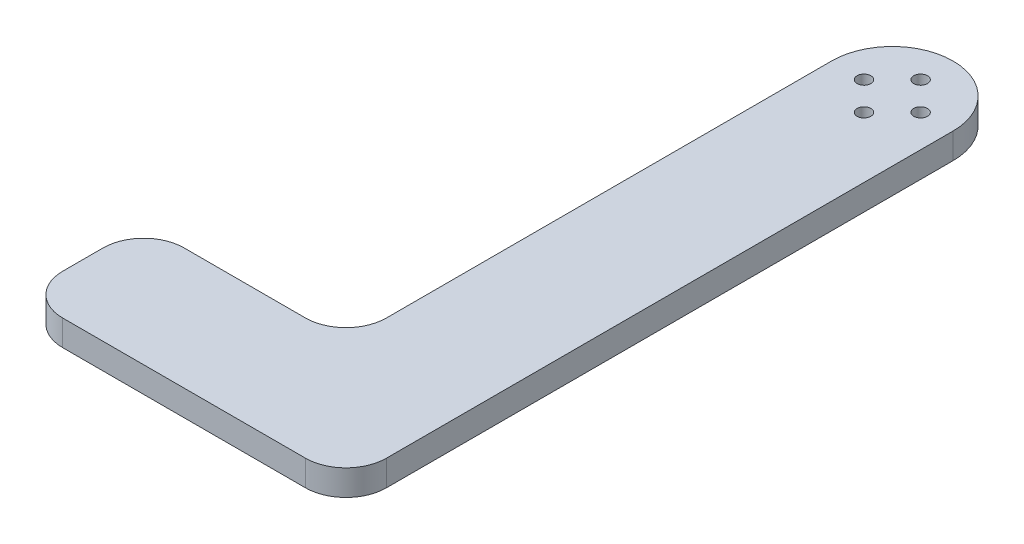
ISO-10303-21;
HEADER;
FILE_DESCRIPTION(('STEP AP214'),'2;1');
FILE_NAME('part.step','',(''),(''),'','','');
FILE_SCHEMA(('AUTOMOTIVE_DESIGN { 1 0 10303 214 1 1 1 1 }'));
ENDSEC;
DATA;
#1=APPLICATION_CONTEXT('core data for automotive mechanical design processes');
#2=APPLICATION_PROTOCOL_DEFINITION('international standard','automotive_design',2000,#1);
#3=PRODUCT_CONTEXT('',#1,'mechanical');
#4=PRODUCT('Part','Part','',(#3));
#5=PRODUCT_RELATED_PRODUCT_CATEGORY('part','',(#4));
#6=PRODUCT_DEFINITION_FORMATION('','',#4);
#7=PRODUCT_DEFINITION_CONTEXT('part definition',#1,'design');
#8=PRODUCT_DEFINITION('design','',#6,#7);
#9=PRODUCT_DEFINITION_SHAPE('','',#8);
#10=(LENGTH_UNIT() NAMED_UNIT(*) SI_UNIT(.MILLI.,.METRE.));
#11=(NAMED_UNIT(*) PLANE_ANGLE_UNIT() SI_UNIT($,.RADIAN.));
#12=(NAMED_UNIT(*) SI_UNIT($,.STERADIAN.) SOLID_ANGLE_UNIT());
#13=UNCERTAINTY_MEASURE_WITH_UNIT(LENGTH_MEASURE(1.E-05),#10,'distance_accuracy_value','');
#14=(GEOMETRIC_REPRESENTATION_CONTEXT(3) GLOBAL_UNCERTAINTY_ASSIGNED_CONTEXT((#13)) GLOBAL_UNIT_ASSIGNED_CONTEXT((#10,
#11,#12)) REPRESENTATION_CONTEXT('',''));
#15=CARTESIAN_POINT('',(0.,0.,0.));
#16=DIRECTION('',(0.,0.,1.));
#17=DIRECTION('',(1.,0.,0.));
#18=AXIS2_PLACEMENT_3D('',#15,#16,#17);
#19=CARTESIAN_POINT('',(15.,6.35,0.));
#20=DIRECTION('',(-1.,0.,0.));
#21=DIRECTION('',(0.,0.,1.));
#22=AXIS2_PLACEMENT_3D('',#19,#20,#21);
#23=PLANE('',#22);
#24=DIRECTION('',(0.,0.,-1.));
#25=VECTOR('',#24,1.);
#26=CARTESIAN_POINT('',(15.,6.35,0.));
#27=LINE('',#26,#25);
#28=CARTESIAN_POINT('',(15.,6.35,140.));
#29=VERTEX_POINT('',#28);
#30=CARTESIAN_POINT('',(15.,6.35,0.));
#31=VERTEX_POINT('',#30);
#32=EDGE_CURVE('E120',#29,#31,#27,.T.);
#33=ORIENTED_EDGE('',*,*,#32,.F.);
#34=DIRECTION('',(0.,-1.,0.));
#35=VECTOR('',#34,1.);
#36=CARTESIAN_POINT('',(15.,6.35,140.));
#37=LINE('',#36,#35);
#38=CARTESIAN_POINT('',(15.,0.,140.));
#39=VERTEX_POINT('',#38);
#40=EDGE_CURVE('E150',#29,#39,#37,.T.);
#41=ORIENTED_EDGE('',*,*,#40,.T.);
#42=DIRECTION('',(0.,0.,-1.));
#43=VECTOR('',#42,1.);
#44=CARTESIAN_POINT('',(15.,0.,0.));
#45=LINE('',#44,#43);
#46=CARTESIAN_POINT('',(15.,0.,0.));
#47=VERTEX_POINT('',#46);
#48=EDGE_CURVE('E147',#39,#47,#45,.T.);
#49=ORIENTED_EDGE('',*,*,#48,.T.);
#50=DIRECTION('',(0.,-1.,0.));
#51=VECTOR('',#50,1.);
#52=CARTESIAN_POINT('',(15.,6.35,0.));
#53=LINE('',#52,#51);
#54=EDGE_CURVE('E139',#31,#47,#53,.T.);
#55=ORIENTED_EDGE('',*,*,#54,.F.);
#56=EDGE_LOOP('',(#33,#41,#49,#55));
#57=FACE_BOUND('',#56,.T.);
#58=ADVANCED_FACE('F43',(#57),#23,.F.);
#59=CARTESIAN_POINT('',(0.,6.35,0.));
#60=DIRECTION('',(0.,-1.,0.));
#61=DIRECTION('',(0.,0.,-1.));
#62=AXIS2_PLACEMENT_3D('',#59,#60,#61);
#63=CYLINDRICAL_SURFACE('',#62,15.);
#64=CARTESIAN_POINT('',(0.,0.,0.));
#65=DIRECTION('',(0.,1.,0.));
#66=DIRECTION('',(0.,0.,1.));
#67=AXIS2_PLACEMENT_3D('',#64,#65,#66);
#68=CIRCLE('',#67,15.);
#69=CARTESIAN_POINT('',(-15.,0.,0.));
#70=VERTEX_POINT('',#69);
#71=EDGE_CURVE('E214',#47,#70,#68,.T.);
#72=ORIENTED_EDGE('',*,*,#71,.T.);
#73=DIRECTION('',(0.,-1.,0.));
#74=VECTOR('',#73,1.);
#75=CARTESIAN_POINT('',(-15.,6.35,0.));
#76=LINE('',#75,#74);
#77=CARTESIAN_POINT('',(-15.,6.35,0.));
#78=VERTEX_POINT('',#77);
#79=EDGE_CURVE('E141',#78,#70,#76,.T.);
#80=ORIENTED_EDGE('',*,*,#79,.F.);
#81=CARTESIAN_POINT('',(0.,6.35,0.));
#82=DIRECTION('',(0.,1.,0.));
#83=DIRECTION('',(0.,0.,1.));
#84=AXIS2_PLACEMENT_3D('',#81,#82,#83);
#85=CIRCLE('',#84,15.);
#86=EDGE_CURVE('E125',#31,#78,#85,.T.);
#87=ORIENTED_EDGE('',*,*,#86,.F.);
#88=ORIENTED_EDGE('',*,*,#54,.T.);
#89=EDGE_LOOP('',(#72,#80,#87,#88));
#90=FACE_BOUND('',#89,.T.);
#91=ADVANCED_FACE('F138',(#90),#63,.T.);
#92=CARTESIAN_POINT('',(-15.,6.35,0.));
#93=DIRECTION('',(1.,0.,0.));
#94=DIRECTION('',(0.,0.,-1.));
#95=AXIS2_PLACEMENT_3D('',#92,#93,#94);
#96=PLANE('',#95);
#97=DIRECTION('',(0.,0.,1.));
#98=VECTOR('',#97,1.);
#99=CARTESIAN_POINT('',(-15.,0.,0.));
#100=LINE('',#99,#98);
#101=CARTESIAN_POINT('',(-15.,0.,110.));
#102=VERTEX_POINT('',#101);
#103=EDGE_CURVE('E205',#70,#102,#100,.T.);
#104=ORIENTED_EDGE('',*,*,#103,.T.);
#105=DIRECTION('',(0.,-1.,0.));
#106=VECTOR('',#105,1.);
#107=CARTESIAN_POINT('',(-15.,6.35,110.));
#108=LINE('',#107,#106);
#109=CARTESIAN_POINT('',(-15.,6.35,110.));
#110=VERTEX_POINT('',#109);
#111=EDGE_CURVE('E196',#102,#110,#108,.F.);
#112=ORIENTED_EDGE('',*,*,#111,.T.);
#113=DIRECTION('',(0.,0.,1.));
#114=VECTOR('',#113,1.);
#115=CARTESIAN_POINT('',(-15.,6.35,0.));
#116=LINE('',#115,#114);
#117=EDGE_CURVE('E144',#78,#110,#116,.T.);
#118=ORIENTED_EDGE('',*,*,#117,.F.);
#119=ORIENTED_EDGE('',*,*,#79,.T.);
#120=EDGE_LOOP('',(#104,#112,#118,#119));
#121=FACE_BOUND('',#120,.T.);
#122=ADVANCED_FACE('F212',(#121),#96,.F.);
#123=CARTESIAN_POINT('',(0.,6.35,120.));
#124=DIRECTION('',(0.,0.,1.));
#125=DIRECTION('',(1.,0.,0.));
#126=AXIS2_PLACEMENT_3D('',#123,#124,#125);
#127=PLANE('',#126);
#128=DIRECTION('',(-1.,0.,0.));
#129=VECTOR('',#128,1.);
#130=CARTESIAN_POINT('',(0.,0.,120.));
#131=LINE('',#130,#129);
#132=CARTESIAN_POINT('',(-25.,0.,120.));
#133=VERTEX_POINT('',#132);
#134=CARTESIAN_POINT('',(-55.,0.,120.));
#135=VERTEX_POINT('',#134);
#136=EDGE_CURVE('E207',#133,#135,#131,.T.);
#137=ORIENTED_EDGE('',*,*,#136,.T.);
#138=DIRECTION('',(0.,-1.,0.));
#139=VECTOR('',#138,1.);
#140=CARTESIAN_POINT('',(-55.,6.35,120.));
#141=LINE('',#140,#139);
#142=CARTESIAN_POINT('',(-55.,6.35,120.));
#143=VERTEX_POINT('',#142);
#144=EDGE_CURVE('E193',#135,#143,#141,.F.);
#145=ORIENTED_EDGE('',*,*,#144,.T.);
#146=DIRECTION('',(-1.,0.,0.));
#147=VECTOR('',#146,1.);
#148=CARTESIAN_POINT('',(0.,6.35,120.));
#149=LINE('',#148,#147);
#150=CARTESIAN_POINT('',(-25.,6.35,120.));
#151=VERTEX_POINT('',#150);
#152=EDGE_CURVE('E218',#151,#143,#149,.T.);
#153=ORIENTED_EDGE('',*,*,#152,.F.);
#154=DIRECTION('',(0.,-1.,0.));
#155=VECTOR('',#154,1.);
#156=CARTESIAN_POINT('',(-25.,0.,120.));
#157=LINE('',#156,#155);
#158=EDGE_CURVE('E189',#151,#133,#157,.T.);
#159=ORIENTED_EDGE('',*,*,#158,.T.);
#160=EDGE_LOOP('',(#137,#145,#153,#159));
#161=FACE_BOUND('',#160,.T.);
#162=ADVANCED_FACE('F220',(#161),#127,.F.);
#163=CARTESIAN_POINT('',(-65.0000000000001,6.35,0.));
#164=DIRECTION('',(1.,0.,0.));
#165=DIRECTION('',(0.,0.,-1.));
#166=AXIS2_PLACEMENT_3D('',#163,#164,#165);
#167=PLANE('',#166);
#168=DIRECTION('',(0.,0.,1.));
#169=VECTOR('',#168,1.);
#170=CARTESIAN_POINT('',(-65.0000000000001,0.,0.));
#171=LINE('',#170,#169);
#172=CARTESIAN_POINT('',(-65.,0.,130.));
#173=VERTEX_POINT('',#172);
#174=CARTESIAN_POINT('',(-65.,0.,140.));
#175=VERTEX_POINT('',#174);
#176=EDGE_CURVE('E240',#173,#175,#171,.T.);
#177=ORIENTED_EDGE('',*,*,#176,.T.);
#178=DIRECTION('',(0.,-1.,0.));
#179=VECTOR('',#178,1.);
#180=CARTESIAN_POINT('',(-65.,6.35,140.));
#181=LINE('',#180,#179);
#182=CARTESIAN_POINT('',(-65.,6.35,140.));
#183=VERTEX_POINT('',#182);
#184=EDGE_CURVE('E59',#175,#183,#181,.F.);
#185=ORIENTED_EDGE('',*,*,#184,.T.);
#186=DIRECTION('',(0.,0.,1.));
#187=VECTOR('',#186,1.);
#188=CARTESIAN_POINT('',(-65.0000000000001,6.35,0.));
#189=LINE('',#188,#187);
#190=CARTESIAN_POINT('',(-65.,6.35,130.));
#191=VERTEX_POINT('',#190);
#192=EDGE_CURVE('E223',#191,#183,#189,.T.);
#193=ORIENTED_EDGE('',*,*,#192,.F.);
#194=DIRECTION('',(0.,-1.,0.));
#195=VECTOR('',#194,1.);
#196=CARTESIAN_POINT('',(-65.,6.35,130.));
#197=LINE('',#196,#195);
#198=EDGE_CURVE('E183',#191,#173,#197,.T.);
#199=ORIENTED_EDGE('',*,*,#198,.T.);
#200=EDGE_LOOP('',(#177,#185,#193,#199));
#201=FACE_BOUND('',#200,.T.);
#202=ADVANCED_FACE('F279',(#201),#167,.F.);
#203=CARTESIAN_POINT('',(0.,6.35,150.));
#204=DIRECTION('',(0.,0.,-1.));
#205=DIRECTION('',(-1.,0.,0.));
#206=AXIS2_PLACEMENT_3D('',#203,#204,#205);
#207=PLANE('',#206);
#208=DIRECTION('',(1.,0.,0.));
#209=VECTOR('',#208,1.);
#210=CARTESIAN_POINT('',(0.,0.,150.));
#211=LINE('',#210,#209);
#212=CARTESIAN_POINT('',(-55.,0.,150.));
#213=VERTEX_POINT('',#212);
#214=CARTESIAN_POINT('',(5.,0.,150.));
#215=VERTEX_POINT('',#214);
#216=EDGE_CURVE('E134',#213,#215,#211,.T.);
#217=ORIENTED_EDGE('',*,*,#216,.T.);
#218=DIRECTION('',(0.,-1.,0.));
#219=VECTOR('',#218,1.);
#220=CARTESIAN_POINT('',(5.,6.35,150.));
#221=LINE('',#220,#219);
#222=CARTESIAN_POINT('',(5.,6.35,150.));
#223=VERTEX_POINT('',#222);
#224=EDGE_CURVE('E173',#215,#223,#221,.F.);
#225=ORIENTED_EDGE('',*,*,#224,.T.);
#226=DIRECTION('',(1.,0.,0.));
#227=VECTOR('',#226,1.);
#228=CARTESIAN_POINT('',(0.,6.35,150.));
#229=LINE('',#228,#227);
#230=CARTESIAN_POINT('',(-55.,6.35,150.));
#231=VERTEX_POINT('',#230);
#232=EDGE_CURVE('E157',#231,#223,#229,.T.);
#233=ORIENTED_EDGE('',*,*,#232,.F.);
#234=DIRECTION('',(0.,-1.,0.));
#235=VECTOR('',#234,1.);
#236=CARTESIAN_POINT('',(-55.,6.35,150.));
#237=LINE('',#236,#235);
#238=EDGE_CURVE('E169',#231,#213,#237,.T.);
#239=ORIENTED_EDGE('',*,*,#238,.T.);
#240=EDGE_LOOP('',(#217,#225,#233,#239));
#241=FACE_BOUND('',#240,.T.);
#242=ADVANCED_FACE('F248',(#241),#207,.F.);
#243=CARTESIAN_POINT('',(0.,6.35,0.));
#244=DIRECTION('',(0.,1.,0.));
#245=DIRECTION('',(0.,0.,1.));
#246=AXIS2_PLACEMENT_3D('',#243,#244,#245);
#247=PLANE('',#246);
#248=CARTESIAN_POINT('',(7.,6.35,0.));
#249=DIRECTION('',(0.,1.,0.));
#250=DIRECTION('',(0.,0.,1.));
#251=AXIS2_PLACEMENT_3D('',#248,#249,#250);
#252=CIRCLE('',#251,1.69999999999999);
#253=CARTESIAN_POINT('',(7.,6.35,1.69999999999992));
#254=VERTEX_POINT('',#253);
#255=EDGE_CURVE('E318',#254,#254,#252,.T.);
#256=ORIENTED_EDGE('',*,*,#255,.F.);
#257=EDGE_LOOP('',(#256));
#258=FACE_BOUND('',#257,.T.);
#259=CARTESIAN_POINT('',(0.,6.35,7.));
#260=DIRECTION('',(0.,1.,0.));
#261=DIRECTION('',(0.,0.,1.));
#262=AXIS2_PLACEMENT_3D('',#259,#260,#261);
#263=CIRCLE('',#262,1.69999999999999);
#264=CARTESIAN_POINT('',(0.,6.35,8.69999999999999));
#265=VERTEX_POINT('',#264);
#266=EDGE_CURVE('E307',#265,#265,#263,.T.);
#267=ORIENTED_EDGE('',*,*,#266,.F.);
#268=EDGE_LOOP('',(#267));
#269=FACE_BOUND('',#268,.T.);
#270=CARTESIAN_POINT('',(-7.,6.35,0.));
#271=DIRECTION('',(0.,1.,0.));
#272=DIRECTION('',(0.,0.,1.));
#273=AXIS2_PLACEMENT_3D('',#270,#271,#272);
#274=CIRCLE('',#273,1.69999999999999);
#275=CARTESIAN_POINT('',(-7.,6.35,1.70000000000001));
#276=VERTEX_POINT('',#275);
#277=EDGE_CURVE('E315',#276,#276,#274,.T.);
#278=ORIENTED_EDGE('',*,*,#277,.F.);
#279=EDGE_LOOP('',(#278));
#280=FACE_BOUND('',#279,.T.);
#281=CARTESIAN_POINT('',(0.,6.35,-7.));
#282=DIRECTION('',(0.,1.,0.));
#283=DIRECTION('',(0.,0.,1.));
#284=AXIS2_PLACEMENT_3D('',#281,#282,#283);
#285=CIRCLE('',#284,1.69999999999999);
#286=CARTESIAN_POINT('',(0.,6.35,-5.30000000000001));
#287=VERTEX_POINT('',#286);
#288=EDGE_CURVE('E329',#287,#287,#285,.T.);
#289=ORIENTED_EDGE('',*,*,#288,.F.);
#290=EDGE_LOOP('',(#289));
#291=FACE_BOUND('',#290,.T.);
#292=ORIENTED_EDGE('',*,*,#232,.T.);
#293=CARTESIAN_POINT('',(5.,6.35,140.));
#294=DIRECTION('',(0.,1.,0.));
#295=DIRECTION('',(0.,0.,1.));
#296=AXIS2_PLACEMENT_3D('',#293,#294,#295);
#297=CIRCLE('',#296,10.);
#298=EDGE_CURVE('E128',#223,#29,#297,.T.);
#299=ORIENTED_EDGE('',*,*,#298,.T.);
#300=ORIENTED_EDGE('',*,*,#32,.T.);
#301=ORIENTED_EDGE('',*,*,#86,.T.);
#302=ORIENTED_EDGE('',*,*,#117,.T.);
#303=CARTESIAN_POINT('',(-25.,6.35,110.));
#304=DIRECTION('',(0.,1.,0.));
#305=DIRECTION('',(0.,0.,1.));
#306=AXIS2_PLACEMENT_3D('',#303,#304,#305);
#307=CIRCLE('',#306,10.);
#308=EDGE_CURVE('E11',#110,#151,#307,.F.);
#309=ORIENTED_EDGE('',*,*,#308,.T.);
#310=ORIENTED_EDGE('',*,*,#152,.T.);
#311=CARTESIAN_POINT('',(-55.,6.35,130.));
#312=DIRECTION('',(0.,1.,0.));
#313=DIRECTION('',(0.,0.,1.));
#314=AXIS2_PLACEMENT_3D('',#311,#312,#313);
#315=CIRCLE('',#314,10.);
#316=EDGE_CURVE('E66',#143,#191,#315,.T.);
#317=ORIENTED_EDGE('',*,*,#316,.T.);
#318=ORIENTED_EDGE('',*,*,#192,.T.);
#319=CARTESIAN_POINT('',(-55.,6.35,140.));
#320=DIRECTION('',(0.,1.,0.));
#321=DIRECTION('',(0.,0.,1.));
#322=AXIS2_PLACEMENT_3D('',#319,#320,#321);
#323=CIRCLE('',#322,10.);
#324=EDGE_CURVE('E178',#183,#231,#323,.T.);
#325=ORIENTED_EDGE('',*,*,#324,.T.);
#326=EDGE_LOOP('',(#292,#299,#300,#301,#302,#309,#310,#317,#318,#325));
#327=FACE_BOUND('',#326,.T.);
#328=ADVANCED_FACE('F123',(#258,#269,#280,#291,#327),#247,.T.);
#329=CARTESIAN_POINT('',(0.,0.,0.));
#330=DIRECTION('',(0.,1.,0.));
#331=DIRECTION('',(0.,0.,1.));
#332=AXIS2_PLACEMENT_3D('',#329,#330,#331);
#333=PLANE('',#332);
#334=CARTESIAN_POINT('',(7.,0.,0.));
#335=DIRECTION('',(0.,1.,0.));
#336=DIRECTION('',(0.,0.,1.));
#337=AXIS2_PLACEMENT_3D('',#334,#335,#336);
#338=CIRCLE('',#337,1.7);
#339=CARTESIAN_POINT('',(7.,0.,1.69999999999992));
#340=VERTEX_POINT('',#339);
#341=EDGE_CURVE('E310',#340,#340,#338,.T.);
#342=ORIENTED_EDGE('',*,*,#341,.T.);
#343=EDGE_LOOP('',(#342));
#344=FACE_BOUND('',#343,.T.);
#345=CARTESIAN_POINT('',(0.,0.,7.));
#346=DIRECTION('',(0.,1.,0.));
#347=DIRECTION('',(0.,0.,1.));
#348=AXIS2_PLACEMENT_3D('',#345,#346,#347);
#349=CIRCLE('',#348,1.7);
#350=CARTESIAN_POINT('',(0.,0.,8.7));
#351=VERTEX_POINT('',#350);
#352=EDGE_CURVE('E304',#351,#351,#349,.T.);
#353=ORIENTED_EDGE('',*,*,#352,.T.);
#354=EDGE_LOOP('',(#353));
#355=FACE_BOUND('',#354,.T.);
#356=CARTESIAN_POINT('',(-7.,0.,0.));
#357=DIRECTION('',(0.,1.,0.));
#358=DIRECTION('',(0.,0.,1.));
#359=AXIS2_PLACEMENT_3D('',#356,#357,#358);
#360=CIRCLE('',#359,1.7);
#361=CARTESIAN_POINT('',(-7.,0.,1.70000000000002));
#362=VERTEX_POINT('',#361);
#363=EDGE_CURVE('E325',#362,#362,#360,.T.);
#364=ORIENTED_EDGE('',*,*,#363,.T.);
#365=EDGE_LOOP('',(#364));
#366=FACE_BOUND('',#365,.T.);
#367=CARTESIAN_POINT('',(0.,0.,-7.));
#368=DIRECTION('',(0.,1.,0.));
#369=DIRECTION('',(0.,0.,1.));
#370=AXIS2_PLACEMENT_3D('',#367,#368,#369);
#371=CIRCLE('',#370,1.7);
#372=CARTESIAN_POINT('',(0.,0.,-5.3));
#373=VERTEX_POINT('',#372);
#374=EDGE_CURVE('E235',#373,#373,#371,.T.);
#375=ORIENTED_EDGE('',*,*,#374,.T.);
#376=EDGE_LOOP('',(#375));
#377=FACE_BOUND('',#376,.T.);
#378=ORIENTED_EDGE('',*,*,#48,.F.);
#379=CARTESIAN_POINT('',(5.,0.,140.));
#380=DIRECTION('',(0.,1.,0.));
#381=DIRECTION('',(0.,0.,1.));
#382=AXIS2_PLACEMENT_3D('',#379,#380,#381);
#383=CIRCLE('',#382,10.);
#384=EDGE_CURVE('E166',#39,#215,#383,.F.);
#385=ORIENTED_EDGE('',*,*,#384,.T.);
#386=ORIENTED_EDGE('',*,*,#216,.F.);
#387=CARTESIAN_POINT('',(-55.,0.,140.));
#388=DIRECTION('',(0.,1.,0.));
#389=DIRECTION('',(0.,0.,1.));
#390=AXIS2_PLACEMENT_3D('',#387,#388,#389);
#391=CIRCLE('',#390,10.);
#392=EDGE_CURVE('E163',#213,#175,#391,.F.);
#393=ORIENTED_EDGE('',*,*,#392,.T.);
#394=ORIENTED_EDGE('',*,*,#176,.F.);
#395=CARTESIAN_POINT('',(-55.,0.,130.));
#396=DIRECTION('',(0.,1.,0.));
#397=DIRECTION('',(0.,0.,1.));
#398=AXIS2_PLACEMENT_3D('',#395,#396,#397);
#399=CIRCLE('',#398,10.);
#400=EDGE_CURVE('E155',#173,#135,#399,.F.);
#401=ORIENTED_EDGE('',*,*,#400,.T.);
#402=ORIENTED_EDGE('',*,*,#136,.F.);
#403=CARTESIAN_POINT('',(-25.,0.,110.));
#404=DIRECTION('',(0.,1.,0.));
#405=DIRECTION('',(0.,0.,1.));
#406=AXIS2_PLACEMENT_3D('',#403,#404,#405);
#407=CIRCLE('',#406,10.);
#408=EDGE_CURVE('E52',#133,#102,#407,.T.);
#409=ORIENTED_EDGE('',*,*,#408,.T.);
#410=ORIENTED_EDGE('',*,*,#103,.F.);
#411=ORIENTED_EDGE('',*,*,#71,.F.);
#412=EDGE_LOOP('',(#378,#385,#386,#393,#394,#401,#402,#409,#410,#411));
#413=FACE_BOUND('',#412,.T.);
#414=ADVANCED_FACE('F204',(#344,#355,#366,#377,#413),#333,.F.);
#415=CARTESIAN_POINT('',(0.,6.35,-7.));
#416=DIRECTION('',(0.,1.,0.));
#417=DIRECTION('',(0.,0.,1.));
#418=AXIS2_PLACEMENT_3D('',#415,#416,#417);
#419=CYLINDRICAL_SURFACE('',#418,1.69999999999999);
#420=ORIENTED_EDGE('',*,*,#374,.F.);
#421=EDGE_LOOP('',(#420));
#422=FACE_BOUND('',#421,.T.);
#423=ORIENTED_EDGE('',*,*,#288,.T.);
#424=EDGE_LOOP('',(#423));
#425=FACE_BOUND('',#424,.T.);
#426=ADVANCED_FACE('F285',(#422,#425),#419,.F.);
#427=CARTESIAN_POINT('',(-7.,6.35,0.));
#428=DIRECTION('',(0.,1.,0.));
#429=DIRECTION('',(0.,0.,1.));
#430=AXIS2_PLACEMENT_3D('',#427,#428,#429);
#431=CYLINDRICAL_SURFACE('',#430,1.69999999999999);
#432=ORIENTED_EDGE('',*,*,#363,.F.);
#433=EDGE_LOOP('',(#432));
#434=FACE_BOUND('',#433,.T.);
#435=ORIENTED_EDGE('',*,*,#277,.T.);
#436=EDGE_LOOP('',(#435));
#437=FACE_BOUND('',#436,.T.);
#438=ADVANCED_FACE('F292',(#434,#437),#431,.F.);
#439=CARTESIAN_POINT('',(0.,6.35,7.));
#440=DIRECTION('',(0.,1.,0.));
#441=DIRECTION('',(0.,0.,1.));
#442=AXIS2_PLACEMENT_3D('',#439,#440,#441);
#443=CYLINDRICAL_SURFACE('',#442,1.69999999999999);
#444=ORIENTED_EDGE('',*,*,#352,.F.);
#445=EDGE_LOOP('',(#444));
#446=FACE_BOUND('',#445,.T.);
#447=ORIENTED_EDGE('',*,*,#266,.T.);
#448=EDGE_LOOP('',(#447));
#449=FACE_BOUND('',#448,.T.);
#450=ADVANCED_FACE('F265',(#446,#449),#443,.F.);
#451=CARTESIAN_POINT('',(7.,6.35,0.));
#452=DIRECTION('',(0.,1.,0.));
#453=DIRECTION('',(0.,0.,1.));
#454=AXIS2_PLACEMENT_3D('',#451,#452,#453);
#455=CYLINDRICAL_SURFACE('',#454,1.69999999999999);
#456=ORIENTED_EDGE('',*,*,#341,.F.);
#457=EDGE_LOOP('',(#456));
#458=FACE_BOUND('',#457,.T.);
#459=ORIENTED_EDGE('',*,*,#255,.T.);
#460=EDGE_LOOP('',(#459));
#461=FACE_BOUND('',#460,.T.);
#462=ADVANCED_FACE('F255',(#458,#461),#455,.F.);
#463=CARTESIAN_POINT('',(5.,6.35,140.));
#464=DIRECTION('',(0.,-1.,0.));
#465=DIRECTION('',(0.,0.,-1.));
#466=AXIS2_PLACEMENT_3D('',#463,#464,#465);
#467=CYLINDRICAL_SURFACE('',#466,10.);
#468=ORIENTED_EDGE('',*,*,#298,.F.);
#469=ORIENTED_EDGE('',*,*,#224,.F.);
#470=ORIENTED_EDGE('',*,*,#384,.F.);
#471=ORIENTED_EDGE('',*,*,#40,.F.);
#472=EDGE_LOOP('',(#468,#469,#470,#471));
#473=FACE_BOUND('',#472,.T.);
#474=ADVANCED_FACE('F252',(#473),#467,.T.);
#475=CARTESIAN_POINT('',(-55.,6.35,140.));
#476=DIRECTION('',(0.,-1.,0.));
#477=DIRECTION('',(0.,0.,-1.));
#478=AXIS2_PLACEMENT_3D('',#475,#476,#477);
#479=CYLINDRICAL_SURFACE('',#478,10.);
#480=ORIENTED_EDGE('',*,*,#324,.F.);
#481=ORIENTED_EDGE('',*,*,#184,.F.);
#482=ORIENTED_EDGE('',*,*,#392,.F.);
#483=ORIENTED_EDGE('',*,*,#238,.F.);
#484=EDGE_LOOP('',(#480,#481,#482,#483));
#485=FACE_BOUND('',#484,.T.);
#486=ADVANCED_FACE('F254',(#485),#479,.T.);
#487=CARTESIAN_POINT('',(-55.,6.35,130.));
#488=DIRECTION('',(0.,-1.,0.));
#489=DIRECTION('',(0.,0.,-1.));
#490=AXIS2_PLACEMENT_3D('',#487,#488,#489);
#491=CYLINDRICAL_SURFACE('',#490,10.);
#492=ORIENTED_EDGE('',*,*,#316,.F.);
#493=ORIENTED_EDGE('',*,*,#144,.F.);
#494=ORIENTED_EDGE('',*,*,#400,.F.);
#495=ORIENTED_EDGE('',*,*,#198,.F.);
#496=EDGE_LOOP('',(#492,#493,#494,#495));
#497=FACE_BOUND('',#496,.T.);
#498=ADVANCED_FACE('F261',(#497),#491,.T.);
#499=CARTESIAN_POINT('',(-25.,6.35,110.));
#500=DIRECTION('',(0.,1.,0.));
#501=DIRECTION('',(0.,0.,1.));
#502=AXIS2_PLACEMENT_3D('',#499,#500,#501);
#503=CYLINDRICAL_SURFACE('',#502,10.);
#504=ORIENTED_EDGE('',*,*,#308,.F.);
#505=ORIENTED_EDGE('',*,*,#111,.F.);
#506=ORIENTED_EDGE('',*,*,#408,.F.);
#507=ORIENTED_EDGE('',*,*,#158,.F.);
#508=EDGE_LOOP('',(#504,#505,#506,#507));
#509=FACE_BOUND('',#508,.T.);
#510=ADVANCED_FACE('F45',(#509),#503,.F.);
#511=CLOSED_SHELL('',(#58,#91,#122,#162,#202,#242,#328,#414,#426,#438,#450,#462,#474,#486,#498,#510));
#512=MANIFOLD_SOLID_BREP('B2',#511);
#513=ADVANCED_BREP_SHAPE_REPRESENTATION('',(#18,#512),#14);
#514=SHAPE_DEFINITION_REPRESENTATION(#9,#513);
ENDSEC;
END-ISO-10303-21;
